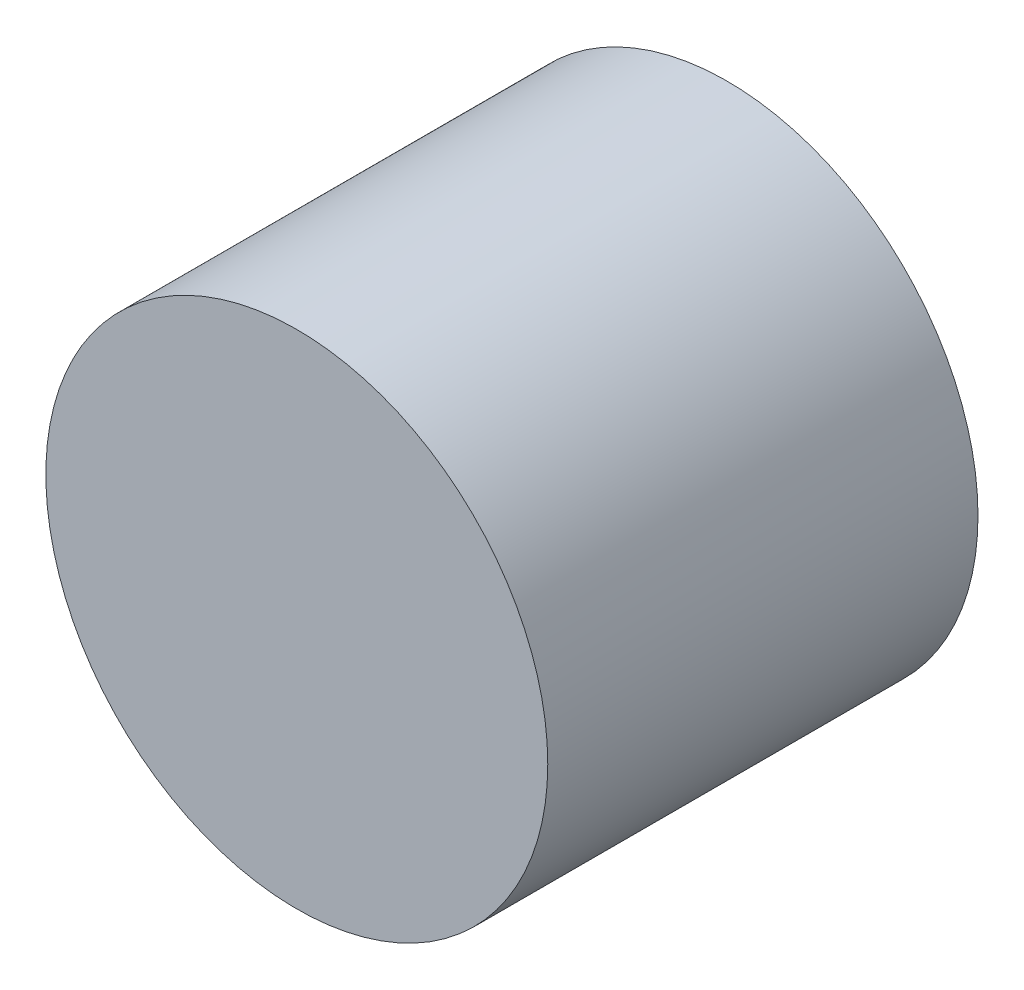
ISO-10303-21;
HEADER;
FILE_DESCRIPTION(('STEP AP214'),'2;1');
FILE_NAME('part.step','',(''),(''),'','','');
FILE_SCHEMA(('AUTOMOTIVE_DESIGN { 1 0 10303 214 1 1 1 1 }'));
ENDSEC;
DATA;
#1=APPLICATION_CONTEXT('core data for automotive mechanical design processes');
#2=APPLICATION_PROTOCOL_DEFINITION('international standard','automotive_design',2000,#1);
#3=PRODUCT_CONTEXT('',#1,'mechanical');
#4=PRODUCT('Part','Part','',(#3));
#5=PRODUCT_RELATED_PRODUCT_CATEGORY('part','',(#4));
#6=PRODUCT_DEFINITION_FORMATION('','',#4);
#7=PRODUCT_DEFINITION_CONTEXT('part definition',#1,'design');
#8=PRODUCT_DEFINITION('design','',#6,#7);
#9=PRODUCT_DEFINITION_SHAPE('','',#8);
#10=(LENGTH_UNIT() NAMED_UNIT(*) SI_UNIT(.MILLI.,.METRE.));
#11=(NAMED_UNIT(*) PLANE_ANGLE_UNIT() SI_UNIT($,.RADIAN.));
#12=(NAMED_UNIT(*) SI_UNIT($,.STERADIAN.) SOLID_ANGLE_UNIT());
#13=UNCERTAINTY_MEASURE_WITH_UNIT(LENGTH_MEASURE(1.E-05),#10,'distance_accuracy_value','');
#14=(GEOMETRIC_REPRESENTATION_CONTEXT(3) GLOBAL_UNCERTAINTY_ASSIGNED_CONTEXT((#13)) GLOBAL_UNIT_ASSIGNED_CONTEXT((#10,
#11,#12)) REPRESENTATION_CONTEXT('',''));
#15=CARTESIAN_POINT('',(0.,0.,0.));
#16=DIRECTION('',(0.,0.,1.));
#17=DIRECTION('',(1.,0.,0.));
#18=AXIS2_PLACEMENT_3D('',#15,#16,#17);
#19=CARTESIAN_POINT('',(0.,0.,30.));
#20=DIRECTION('',(0.,0.,-1.));
#21=DIRECTION('',(-1.,0.,0.));
#22=AXIS2_PLACEMENT_3D('',#19,#20,#21);
#23=CYLINDRICAL_SURFACE('',#22,17.5);
#24=CARTESIAN_POINT('',(0.,0.,30.));
#25=DIRECTION('',(0.,0.,1.));
#26=DIRECTION('',(1.,0.,0.));
#27=AXIS2_PLACEMENT_3D('',#24,#25,#26);
#28=CIRCLE('',#27,17.5);
#29=CARTESIAN_POINT('',(17.5,0.,30.));
#30=VERTEX_POINT('',#29);
#31=EDGE_CURVE('E10',#30,#30,#28,.T.);
#32=ORIENTED_EDGE('',*,*,#31,.F.);
#33=EDGE_LOOP('',(#32));
#34=FACE_BOUND('',#33,.T.);
#35=CARTESIAN_POINT('',(0.,0.,0.));
#36=DIRECTION('',(0.,0.,1.));
#37=DIRECTION('',(1.,0.,0.));
#38=AXIS2_PLACEMENT_3D('',#35,#36,#37);
#39=CIRCLE('',#38,17.5);
#40=CARTESIAN_POINT('',(17.5,0.,0.));
#41=VERTEX_POINT('',#40);
#42=EDGE_CURVE('E40',#41,#41,#39,.T.);
#43=ORIENTED_EDGE('',*,*,#42,.T.);
#44=EDGE_LOOP('',(#43));
#45=FACE_BOUND('',#44,.T.);
#46=ADVANCED_FACE('F37',(#34,#45),#23,.T.);
#47=CARTESIAN_POINT('',(0.,0.,30.));
#48=DIRECTION('',(0.,0.,1.));
#49=DIRECTION('',(1.,0.,0.));
#50=AXIS2_PLACEMENT_3D('',#47,#48,#49);
#51=PLANE('',#50);
#52=ORIENTED_EDGE('',*,*,#31,.T.);
#53=EDGE_LOOP('',(#52));
#54=FACE_BOUND('',#53,.T.);
#55=ADVANCED_FACE('F52',(#54),#51,.T.);
#56=CARTESIAN_POINT('',(0.,0.,0.));
#57=DIRECTION('',(0.,0.,1.));
#58=DIRECTION('',(1.,0.,0.));
#59=AXIS2_PLACEMENT_3D('',#56,#57,#58);
#60=PLANE('',#59);
#61=ORIENTED_EDGE('',*,*,#42,.F.);
#62=EDGE_LOOP('',(#61));
#63=FACE_BOUND('',#62,.T.);
#64=ADVANCED_FACE('F50',(#63),#60,.F.);
#65=CLOSED_SHELL('',(#46,#55,#64));
#66=MANIFOLD_SOLID_BREP('B2',#65);
#67=ADVANCED_BREP_SHAPE_REPRESENTATION('',(#18,#66),#14);
#68=SHAPE_DEFINITION_REPRESENTATION(#9,#67);
ENDSEC;
END-ISO-10303-21;
